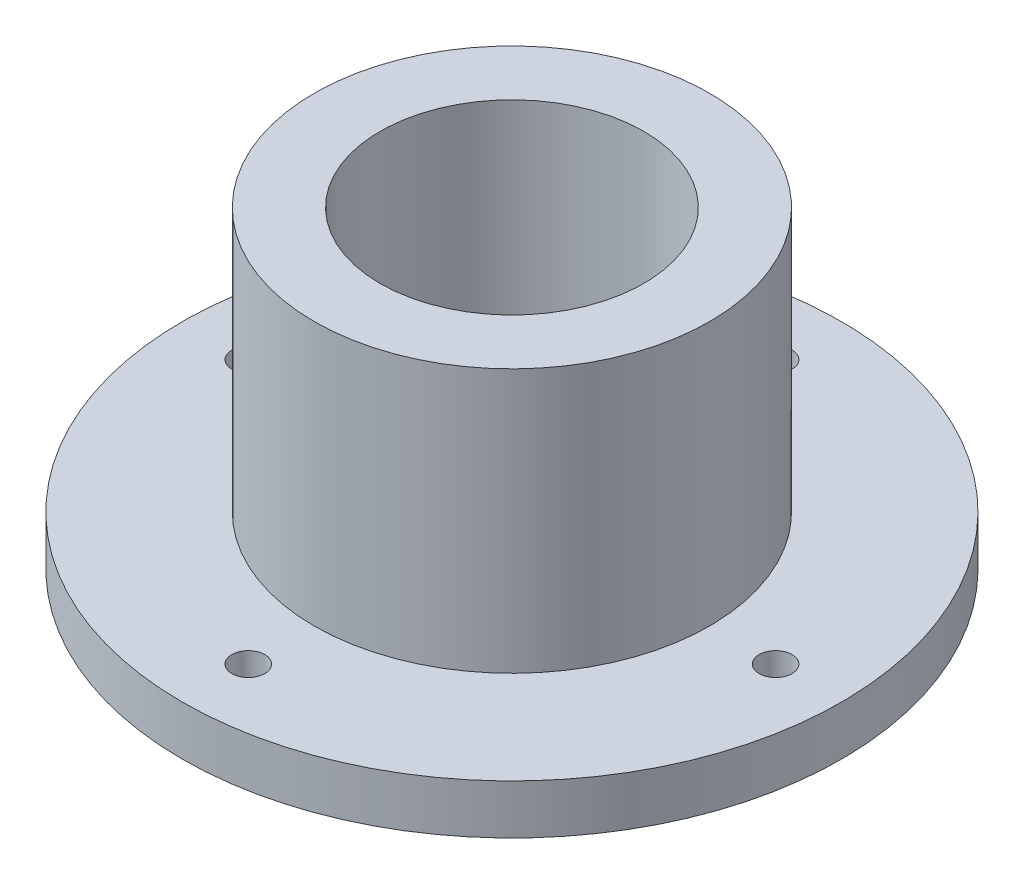
ISO-10303-21;
HEADER;
FILE_DESCRIPTION(('STEP AP214'),'2;1');
FILE_NAME('part.step','',(''),(''),'','','');
FILE_SCHEMA(('AUTOMOTIVE_DESIGN { 1 0 10303 214 1 1 1 1 }'));
ENDSEC;
DATA;
#1=APPLICATION_CONTEXT('core data for automotive mechanical design processes');
#2=APPLICATION_PROTOCOL_DEFINITION('international standard','automotive_design',2000,#1);
#3=PRODUCT_CONTEXT('',#1,'mechanical');
#4=PRODUCT('Part','Part','',(#3));
#5=PRODUCT_RELATED_PRODUCT_CATEGORY('part','',(#4));
#6=PRODUCT_DEFINITION_FORMATION('','',#4);
#7=PRODUCT_DEFINITION_CONTEXT('part definition',#1,'design');
#8=PRODUCT_DEFINITION('design','',#6,#7);
#9=PRODUCT_DEFINITION_SHAPE('','',#8);
#10=(LENGTH_UNIT() NAMED_UNIT(*) SI_UNIT(.MILLI.,.METRE.));
#11=(NAMED_UNIT(*) PLANE_ANGLE_UNIT() SI_UNIT($,.RADIAN.));
#12=(NAMED_UNIT(*) SI_UNIT($,.STERADIAN.) SOLID_ANGLE_UNIT());
#13=UNCERTAINTY_MEASURE_WITH_UNIT(LENGTH_MEASURE(1.E-05),#10,'distance_accuracy_value','');
#14=(GEOMETRIC_REPRESENTATION_CONTEXT(3) GLOBAL_UNCERTAINTY_ASSIGNED_CONTEXT((#13)) GLOBAL_UNIT_ASSIGNED_CONTEXT((#10,
#11,#12)) REPRESENTATION_CONTEXT('',''));
#15=CARTESIAN_POINT('',(0.,0.,0.));
#16=DIRECTION('',(0.,0.,1.));
#17=DIRECTION('',(1.,0.,0.));
#18=AXIS2_PLACEMENT_3D('',#15,#16,#17);
#19=CARTESIAN_POINT('',(0.,-9.525,0.));
#20=DIRECTION('',(0.,1.,0.));
#21=DIRECTION('',(0.,0.,1.));
#22=AXIS2_PLACEMENT_3D('',#19,#20,#21);
#23=CYLINDRICAL_SURFACE('',#22,63.5);
#24=CARTESIAN_POINT('',(0.,-9.525,0.));
#25=DIRECTION('',(0.,1.,0.));
#26=DIRECTION('',(0.,0.,1.));
#27=AXIS2_PLACEMENT_3D('',#24,#25,#26);
#28=CIRCLE('',#27,63.5);
#29=CARTESIAN_POINT('',(0.,-9.525,63.5));
#30=VERTEX_POINT('',#29);
#31=EDGE_CURVE('E48',#30,#30,#28,.T.);
#32=CARTESIAN_POINT('',(0.,0.,0.));
#33=DIRECTION('',(0.,1.,0.));
#34=DIRECTION('',(0.,0.,1.));
#35=AXIS2_PLACEMENT_3D('',#32,#33,#34);
#36=CIRCLE('',#35,63.5);
#37=CARTESIAN_POINT('',(0.,0.,63.5));
#38=VERTEX_POINT('',#37);
#39=EDGE_CURVE('E54',#38,#38,#36,.T.);
#40=CARTESIAN_POINT('',(0.,-9.525,63.5));
#41=CARTESIAN_POINT('',(0.,-9.42578125,63.5));
#42=CARTESIAN_POINT('',(0.,-9.3265625,63.5));
#43=CARTESIAN_POINT('',(0.,-9.128125,63.5));
#44=CARTESIAN_POINT('',(0.,-9.02890625,63.5));
#45=CARTESIAN_POINT('',(0.,-8.83046875,63.5));
#46=CARTESIAN_POINT('',(0.,-8.73125,63.5));
#47=CARTESIAN_POINT('',(0.,-8.5328125,63.5));
#48=CARTESIAN_POINT('',(0.,-8.43359375,63.5));
#49=CARTESIAN_POINT('',(0.,-8.23515625,63.5));
#50=CARTESIAN_POINT('',(0.,-8.1359375,63.5));
#51=CARTESIAN_POINT('',(0.,-7.9375,63.5));
#52=CARTESIAN_POINT('',(0.,-7.83828125,63.5));
#53=CARTESIAN_POINT('',(0.,-7.63984375,63.5));
#54=CARTESIAN_POINT('',(0.,-7.540625,63.5));
#55=CARTESIAN_POINT('',(0.,-7.3421875,63.5));
#56=CARTESIAN_POINT('',(0.,-7.24296875,63.5));
#57=CARTESIAN_POINT('',(0.,-7.04453125,63.5));
#58=CARTESIAN_POINT('',(0.,-6.9453125,63.5));
#59=CARTESIAN_POINT('',(0.,-6.746875,63.5));
#60=CARTESIAN_POINT('',(0.,-6.64765625,63.5));
#61=CARTESIAN_POINT('',(0.,-6.44921875,63.5));
#62=CARTESIAN_POINT('',(0.,-6.35,63.5));
#63=CARTESIAN_POINT('',(0.,-6.1515625,63.5));
#64=CARTESIAN_POINT('',(0.,-6.05234375,63.5));
#65=CARTESIAN_POINT('',(0.,-5.85390625,63.5));
#66=CARTESIAN_POINT('',(0.,-5.7546875,63.5));
#67=CARTESIAN_POINT('',(0.,-5.55625,63.5));
#68=CARTESIAN_POINT('',(0.,-5.45703125,63.5));
#69=CARTESIAN_POINT('',(0.,-5.25859375,63.5));
#70=CARTESIAN_POINT('',(0.,-5.159375,63.5));
#71=CARTESIAN_POINT('',(0.,-4.9609375,63.5));
#72=CARTESIAN_POINT('',(0.,-4.86171875,63.5));
#73=CARTESIAN_POINT('',(0.,-4.66328125,63.5));
#74=CARTESIAN_POINT('',(0.,-4.5640625,63.5));
#75=CARTESIAN_POINT('',(0.,-4.365625,63.5));
#76=CARTESIAN_POINT('',(0.,-4.26640625,63.5));
#77=CARTESIAN_POINT('',(0.,-4.06796875,63.5));
#78=CARTESIAN_POINT('',(0.,-3.96875,63.5));
#79=CARTESIAN_POINT('',(0.,-3.7703125,63.5));
#80=CARTESIAN_POINT('',(0.,-3.67109375,63.5));
#81=CARTESIAN_POINT('',(0.,-3.47265625,63.5));
#82=CARTESIAN_POINT('',(0.,-3.3734375,63.5));
#83=CARTESIAN_POINT('',(0.,-3.175,63.5));
#84=CARTESIAN_POINT('',(0.,-3.07578125,63.5));
#85=CARTESIAN_POINT('',(0.,-2.87734375,63.5));
#86=CARTESIAN_POINT('',(0.,-2.778125,63.5));
#87=CARTESIAN_POINT('',(0.,-2.5796875,63.5));
#88=CARTESIAN_POINT('',(0.,-2.48046875,63.5));
#89=CARTESIAN_POINT('',(0.,-2.28203125,63.5));
#90=CARTESIAN_POINT('',(0.,-2.1828125,63.5));
#91=CARTESIAN_POINT('',(0.,-1.984375,63.5));
#92=CARTESIAN_POINT('',(0.,-1.88515625,63.5));
#93=CARTESIAN_POINT('',(0.,-1.68671875,63.5));
#94=CARTESIAN_POINT('',(0.,-1.5875,63.5));
#95=CARTESIAN_POINT('',(0.,-1.3890625,63.5));
#96=CARTESIAN_POINT('',(0.,-1.28984375,63.5));
#97=CARTESIAN_POINT('',(0.,-1.09140625,63.5));
#98=CARTESIAN_POINT('',(0.,-0.992187500000001,63.5));
#99=CARTESIAN_POINT('',(0.,-0.793750000000001,63.5));
#100=CARTESIAN_POINT('',(0.,-0.69453125,63.5));
#101=CARTESIAN_POINT('',(0.,-0.49609375,63.5));
#102=CARTESIAN_POINT('',(0.,-0.396875,63.5));
#103=CARTESIAN_POINT('',(0.,-0.1984375,63.5));
#104=CARTESIAN_POINT('',(0.,-0.0992187500000001,63.5));
#105=CARTESIAN_POINT('',(0.,0.,63.5));
#106=B_SPLINE_CURVE_WITH_KNOTS('',3,(#40,#41,#42,#43,#44,#45,#46,#47,#48,#49,#50,#51,#52,#53,
#54,#55,#56,#57,#58,#59,#60,#61,#62,#63,#64,#65,#66,#67,#68,#69,#70,#71,#72,#73,#74,#75,#76,#77,
#78,#79,#80,#81,#82,#83,#84,#85,#86,#87,#88,#89,#90,#91,#92,#93,#94,#95,#96,#97,#98,#99,#100,
#101,#102,#103,#104,#105),.UNSPECIFIED.,.F.,.F.,(4,2,2,2,2,2,2,2,2,2,2,2,2,2,2,2,2,2,2,2,2,2,2,
2,2,2,2,2,2,2,2,2,4),(0.,0.29765625,0.5953125,0.892968750000001,1.190625,1.48828125,1.7859375,
2.08359375,2.38125,2.67890625,2.9765625,3.27421875,3.571875,3.86953125,4.1671875,4.46484375,
4.7625,5.06015625,5.3578125,5.65546875,5.953125,6.25078125,6.5484375,6.84609375,7.14375,
7.44140625,7.7390625,8.03671875,8.334375,8.63203125,8.9296875,9.22734375,9.525),.UNSPECIFIED.);
#107=EDGE_CURVE('BSEAM40',#30,#38,#106,.T.);
#108=ORIENTED_EDGE('',*,*,#31,.T.);
#109=ORIENTED_EDGE('',*,*,#39,.F.);
#110=ORIENTED_EDGE('',*,*,#107,.T.);
#111=ORIENTED_EDGE('',*,*,#107,.F.);
#112=EDGE_LOOP('',(#108,#110,#109,#111));
#113=FACE_BOUND('',#112,.T.);
#114=ADVANCED_FACE('F40',(#113),#23,.T.);
#115=CARTESIAN_POINT('',(0.,-9.525,0.));
#116=DIRECTION('',(0.,1.,0.));
#117=DIRECTION('',(0.,0.,1.));
#118=AXIS2_PLACEMENT_3D('',#115,#116,#117);
#119=PLANE('',#118);
#120=CARTESIAN_POINT('',(50.8,-9.525,0.));
#121=DIRECTION('',(0.,-1.,0.));
#122=DIRECTION('',(0.,0.,-1.));
#123=AXIS2_PLACEMENT_3D('',#120,#121,#122);
#124=CIRCLE('',#123,3.175);
#125=CARTESIAN_POINT('',(50.8,-9.525,-3.175));
#126=VERTEX_POINT('',#125);
#127=EDGE_CURVE('E68',#126,#126,#124,.T.);
#128=ORIENTED_EDGE('',*,*,#127,.F.);
#129=EDGE_LOOP('',(#128));
#130=FACE_BOUND('',#129,.T.);
#131=CARTESIAN_POINT('',(0.,-9.525,50.8));
#132=DIRECTION('',(0.,-1.,0.));
#133=DIRECTION('',(0.,0.,-1.));
#134=AXIS2_PLACEMENT_3D('',#131,#132,#133);
#135=CIRCLE('',#134,3.175);
#136=CARTESIAN_POINT('',(0.,-9.525,47.625));
#137=VERTEX_POINT('',#136);
#138=EDGE_CURVE('E98',#137,#137,#135,.T.);
#139=ORIENTED_EDGE('',*,*,#138,.F.);
#140=EDGE_LOOP('',(#139));
#141=FACE_BOUND('',#140,.T.);
#142=CARTESIAN_POINT('',(-50.8,-9.525,0.));
#143=DIRECTION('',(0.,-1.,0.));
#144=DIRECTION('',(0.,0.,-1.));
#145=AXIS2_PLACEMENT_3D('',#142,#143,#144);
#146=CIRCLE('',#145,3.175);
#147=CARTESIAN_POINT('',(-50.8,-9.525,-3.175));
#148=VERTEX_POINT('',#147);
#149=EDGE_CURVE('E94',#148,#148,#146,.T.);
#150=ORIENTED_EDGE('',*,*,#149,.F.);
#151=EDGE_LOOP('',(#150));
#152=FACE_BOUND('',#151,.T.);
#153=CARTESIAN_POINT('',(0.,-9.525,-50.8));
#154=DIRECTION('',(0.,-1.,0.));
#155=DIRECTION('',(0.,0.,-1.));
#156=AXIS2_PLACEMENT_3D('',#153,#154,#155);
#157=CIRCLE('',#156,3.175);
#158=CARTESIAN_POINT('',(0.,-9.525,-53.975));
#159=VERTEX_POINT('',#158);
#160=EDGE_CURVE('E90',#159,#159,#157,.T.);
#161=ORIENTED_EDGE('',*,*,#160,.F.);
#162=EDGE_LOOP('',(#161));
#163=FACE_BOUND('',#162,.T.);
#164=CARTESIAN_POINT('',(0.,-9.525,0.));
#165=DIRECTION('',(0.,1.,0.));
#166=DIRECTION('',(0.,0.,1.));
#167=AXIS2_PLACEMENT_3D('',#164,#165,#166);
#168=CIRCLE('',#167,25.4);
#169=CARTESIAN_POINT('',(0.,-9.525,25.4));
#170=VERTEX_POINT('',#169);
#171=EDGE_CURVE('E83',#170,#170,#168,.F.);
#172=ORIENTED_EDGE('',*,*,#171,.F.);
#173=EDGE_LOOP('',(#172));
#174=FACE_BOUND('',#173,.T.);
#175=ORIENTED_EDGE('',*,*,#31,.F.);
#176=EDGE_LOOP('',(#175));
#177=FACE_BOUND('',#176,.T.);
#178=ADVANCED_FACE('F108',(#130,#141,#152,#163,#174,#177),#119,.F.);
#179=CARTESIAN_POINT('',(0.,0.,0.));
#180=DIRECTION('',(0.,1.,0.));
#181=DIRECTION('',(0.,0.,1.));
#182=AXIS2_PLACEMENT_3D('',#179,#180,#181);
#183=PLANE('',#182);
#184=CARTESIAN_POINT('',(50.8,0.,0.));
#185=DIRECTION('',(0.,1.,0.));
#186=DIRECTION('',(0.,0.,1.));
#187=AXIS2_PLACEMENT_3D('',#184,#185,#186);
#188=CIRCLE('',#187,3.175);
#189=CARTESIAN_POINT('',(50.8,0.,3.175));
#190=VERTEX_POINT('',#189);
#191=EDGE_CURVE('E43',#190,#190,#188,.T.);
#192=ORIENTED_EDGE('',*,*,#191,.F.);
#193=EDGE_LOOP('',(#192));
#194=FACE_BOUND('',#193,.T.);
#195=CARTESIAN_POINT('',(0.,0.,50.8));
#196=DIRECTION('',(0.,1.,0.));
#197=DIRECTION('',(0.,0.,1.));
#198=AXIS2_PLACEMENT_3D('',#195,#196,#197);
#199=CIRCLE('',#198,3.175);
#200=CARTESIAN_POINT('',(0.,0.,53.975));
#201=VERTEX_POINT('',#200);
#202=EDGE_CURVE('E71',#201,#201,#199,.T.);
#203=ORIENTED_EDGE('',*,*,#202,.F.);
#204=EDGE_LOOP('',(#203));
#205=FACE_BOUND('',#204,.T.);
#206=CARTESIAN_POINT('',(-50.8,0.,0.));
#207=DIRECTION('',(0.,1.,0.));
#208=DIRECTION('',(0.,0.,1.));
#209=AXIS2_PLACEMENT_3D('',#206,#207,#208);
#210=CIRCLE('',#209,3.175);
#211=CARTESIAN_POINT('',(-50.8,0.,3.175));
#212=VERTEX_POINT('',#211);
#213=EDGE_CURVE('E67',#212,#212,#210,.T.);
#214=ORIENTED_EDGE('',*,*,#213,.F.);
#215=EDGE_LOOP('',(#214));
#216=FACE_BOUND('',#215,.T.);
#217=CARTESIAN_POINT('',(0.,0.,-50.8));
#218=DIRECTION('',(0.,1.,0.));
#219=DIRECTION('',(0.,0.,1.));
#220=AXIS2_PLACEMENT_3D('',#217,#218,#219);
#221=CIRCLE('',#220,3.175);
#222=CARTESIAN_POINT('',(0.,0.,-47.625));
#223=VERTEX_POINT('',#222);
#224=EDGE_CURVE('E63',#223,#223,#221,.T.);
#225=ORIENTED_EDGE('',*,*,#224,.F.);
#226=EDGE_LOOP('',(#225));
#227=FACE_BOUND('',#226,.T.);
#228=CARTESIAN_POINT('',(0.,0.,0.));
#229=DIRECTION('',(0.,1.,0.));
#230=DIRECTION('',(0.,0.,1.));
#231=AXIS2_PLACEMENT_3D('',#228,#229,#230);
#232=CIRCLE('',#231,38.1);
#233=CARTESIAN_POINT('',(0.,0.,38.1));
#234=VERTEX_POINT('',#233);
#235=EDGE_CURVE('E10',#234,#234,#232,.T.);
#236=ORIENTED_EDGE('',*,*,#235,.F.);
#237=EDGE_LOOP('',(#236));
#238=FACE_BOUND('',#237,.T.);
#239=ORIENTED_EDGE('',*,*,#39,.T.);
#240=EDGE_LOOP('',(#239));
#241=FACE_BOUND('',#240,.T.);
#242=ADVANCED_FACE('F111',(#194,#205,#216,#227,#238,#241),#183,.T.);
#243=CARTESIAN_POINT('',(0.,50.8,0.));
#244=DIRECTION('',(0.,-1.,0.));
#245=DIRECTION('',(0.,0.,-1.));
#246=AXIS2_PLACEMENT_3D('',#243,#244,#245);
#247=CYLINDRICAL_SURFACE('',#246,38.1);
#248=CARTESIAN_POINT('',(0.,50.8,0.));
#249=DIRECTION('',(0.,1.,0.));
#250=DIRECTION('',(0.,0.,1.));
#251=AXIS2_PLACEMENT_3D('',#248,#249,#250);
#252=CIRCLE('',#251,38.1);
#253=CARTESIAN_POINT('',(0.,50.8,38.1));
#254=VERTEX_POINT('',#253);
#255=EDGE_CURVE('E57',#254,#254,#252,.T.);
#256=ORIENTED_EDGE('',*,*,#255,.F.);
#257=EDGE_LOOP('',(#256));
#258=FACE_BOUND('',#257,.T.);
#259=ORIENTED_EDGE('',*,*,#235,.T.);
#260=EDGE_LOOP('',(#259));
#261=FACE_BOUND('',#260,.T.);
#262=ADVANCED_FACE('F128',(#258,#261),#247,.T.);
#263=CARTESIAN_POINT('',(0.,50.8,0.));
#264=DIRECTION('',(0.,1.,0.));
#265=DIRECTION('',(0.,0.,1.));
#266=AXIS2_PLACEMENT_3D('',#263,#264,#265);
#267=PLANE('',#266);
#268=CARTESIAN_POINT('',(0.,50.8,0.));
#269=DIRECTION('',(0.,1.,0.));
#270=DIRECTION('',(0.,0.,1.));
#271=AXIS2_PLACEMENT_3D('',#268,#269,#270);
#272=CIRCLE('',#271,25.4);
#273=CARTESIAN_POINT('',(0.,50.8,25.4));
#274=VERTEX_POINT('',#273);
#275=EDGE_CURVE('E78',#274,#274,#272,.T.);
#276=ORIENTED_EDGE('',*,*,#275,.F.);
#277=EDGE_LOOP('',(#276));
#278=FACE_BOUND('',#277,.T.);
#279=ORIENTED_EDGE('',*,*,#255,.T.);
#280=EDGE_LOOP('',(#279));
#281=FACE_BOUND('',#280,.T.);
#282=ADVANCED_FACE('F134',(#278,#281),#267,.T.);
#283=CARTESIAN_POINT('',(0.,50.8,0.));
#284=DIRECTION('',(0.,-1.,0.));
#285=DIRECTION('',(0.,0.,-1.));
#286=AXIS2_PLACEMENT_3D('',#283,#284,#285);
#287=CYLINDRICAL_SURFACE('',#286,25.4);
#288=ORIENTED_EDGE('',*,*,#275,.T.);
#289=EDGE_LOOP('',(#288));
#290=FACE_BOUND('',#289,.T.);
#291=ORIENTED_EDGE('',*,*,#171,.T.);
#292=EDGE_LOOP('',(#291));
#293=FACE_BOUND('',#292,.T.);
#294=ADVANCED_FACE('F141',(#290,#293),#287,.F.);
#295=CARTESIAN_POINT('',(0.,41.275,-50.8));
#296=DIRECTION('',(0.,-1.,0.));
#297=DIRECTION('',(0.,0.,-1.));
#298=AXIS2_PLACEMENT_3D('',#295,#296,#297);
#299=CYLINDRICAL_SURFACE('',#298,3.175);
#300=ORIENTED_EDGE('',*,*,#224,.T.);
#301=EDGE_LOOP('',(#300));
#302=FACE_BOUND('',#301,.T.);
#303=ORIENTED_EDGE('',*,*,#160,.T.);
#304=EDGE_LOOP('',(#303));
#305=FACE_BOUND('',#304,.T.);
#306=ADVANCED_FACE('F145',(#302,#305),#299,.F.);
#307=CARTESIAN_POINT('',(-50.8,41.275,0.));
#308=DIRECTION('',(0.,-1.,0.));
#309=DIRECTION('',(0.,0.,-1.));
#310=AXIS2_PLACEMENT_3D('',#307,#308,#309);
#311=CYLINDRICAL_SURFACE('',#310,3.175);
#312=ORIENTED_EDGE('',*,*,#213,.T.);
#313=EDGE_LOOP('',(#312));
#314=FACE_BOUND('',#313,.T.);
#315=ORIENTED_EDGE('',*,*,#149,.T.);
#316=EDGE_LOOP('',(#315));
#317=FACE_BOUND('',#316,.T.);
#318=ADVANCED_FACE('F148',(#314,#317),#311,.F.);
#319=CARTESIAN_POINT('',(0.,41.275,50.8));
#320=DIRECTION('',(0.,-1.,0.));
#321=DIRECTION('',(0.,0.,-1.));
#322=AXIS2_PLACEMENT_3D('',#319,#320,#321);
#323=CYLINDRICAL_SURFACE('',#322,3.175);
#324=ORIENTED_EDGE('',*,*,#202,.T.);
#325=EDGE_LOOP('',(#324));
#326=FACE_BOUND('',#325,.T.);
#327=ORIENTED_EDGE('',*,*,#138,.T.);
#328=EDGE_LOOP('',(#327));
#329=FACE_BOUND('',#328,.T.);
#330=ADVANCED_FACE('F152',(#326,#329),#323,.F.);
#331=CARTESIAN_POINT('',(50.8,41.275,0.));
#332=DIRECTION('',(0.,-1.,0.));
#333=DIRECTION('',(0.,0.,-1.));
#334=AXIS2_PLACEMENT_3D('',#331,#332,#333);
#335=CYLINDRICAL_SURFACE('',#334,3.175);
#336=ORIENTED_EDGE('',*,*,#191,.T.);
#337=EDGE_LOOP('',(#336));
#338=FACE_BOUND('',#337,.T.);
#339=ORIENTED_EDGE('',*,*,#127,.T.);
#340=EDGE_LOOP('',(#339));
#341=FACE_BOUND('',#340,.T.);
#342=ADVANCED_FACE('F106',(#338,#341),#335,.F.);
#343=CLOSED_SHELL('',(#114,#178,#242,#262,#282,#294,#306,#318,#330,#342));
#344=MANIFOLD_SOLID_BREP('B2',#343);
#345=ADVANCED_BREP_SHAPE_REPRESENTATION('',(#18,#344),#14);
#346=SHAPE_DEFINITION_REPRESENTATION(#9,#345);
ENDSEC;
END-ISO-10303-21;
